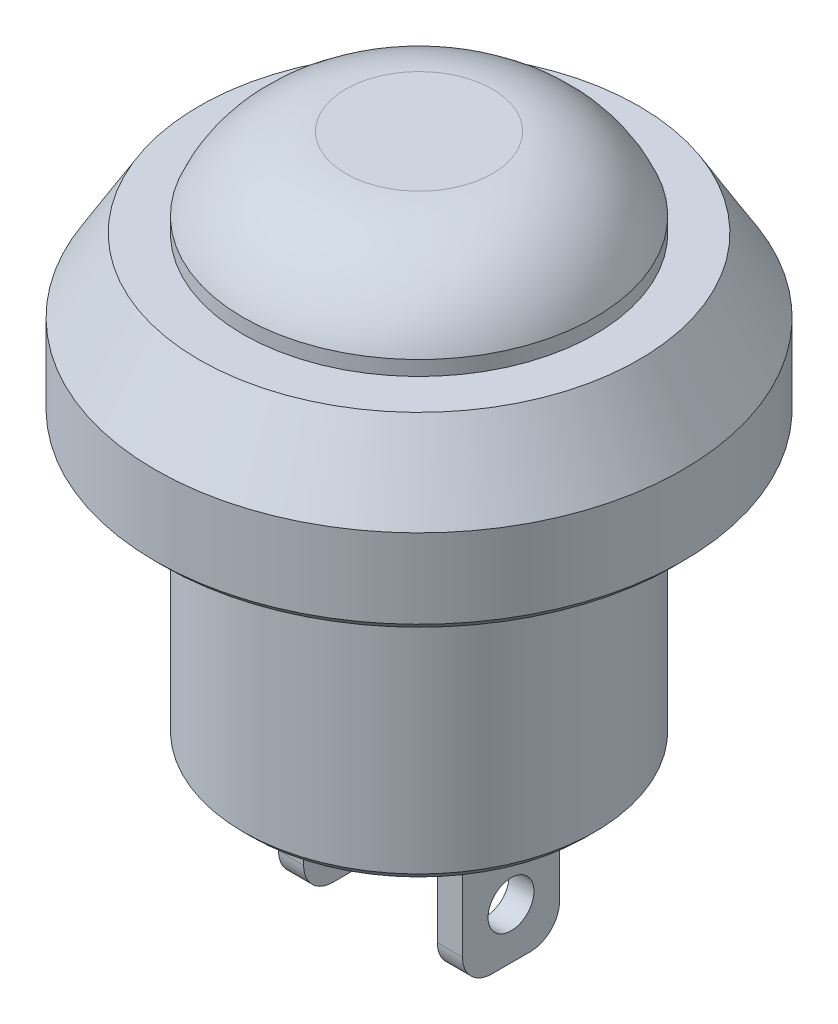
ISO-10303-21;
HEADER;
FILE_DESCRIPTION(('STEP AP214'),'2;1');
FILE_NAME('part.step','',(''),(''),'','','');
FILE_SCHEMA(('AUTOMOTIVE_DESIGN { 1 0 10303 214 1 1 1 1 }'));
ENDSEC;
DATA;
#1=APPLICATION_CONTEXT('core data for automotive mechanical design processes');
#2=APPLICATION_PROTOCOL_DEFINITION('international standard','automotive_design',2000,#1);
#3=PRODUCT_CONTEXT('',#1,'mechanical');
#4=PRODUCT('Part','Part','',(#3));
#5=PRODUCT_RELATED_PRODUCT_CATEGORY('part','',(#4));
#6=PRODUCT_DEFINITION_FORMATION('','',#4);
#7=PRODUCT_DEFINITION_CONTEXT('part definition',#1,'design');
#8=PRODUCT_DEFINITION('design','',#6,#7);
#9=PRODUCT_DEFINITION_SHAPE('','',#8);
#10=(LENGTH_UNIT() NAMED_UNIT(*) SI_UNIT(.MILLI.,.METRE.));
#11=(NAMED_UNIT(*) PLANE_ANGLE_UNIT() SI_UNIT($,.RADIAN.));
#12=(NAMED_UNIT(*) SI_UNIT($,.STERADIAN.) SOLID_ANGLE_UNIT());
#13=UNCERTAINTY_MEASURE_WITH_UNIT(LENGTH_MEASURE(1.E-05),#10,'distance_accuracy_value','');
#14=(GEOMETRIC_REPRESENTATION_CONTEXT(3) GLOBAL_UNCERTAINTY_ASSIGNED_CONTEXT((#13)) GLOBAL_UNIT_ASSIGNED_CONTEXT((#10,
#11,#12)) REPRESENTATION_CONTEXT('',''));
#15=CARTESIAN_POINT('',(0.,0.,0.));
#16=DIRECTION('',(0.,0.,1.));
#17=DIRECTION('',(1.,0.,0.));
#18=AXIS2_PLACEMENT_3D('',#15,#16,#17);
#19=CARTESIAN_POINT('',(6.00000000000001,-18.,0.));
#20=DIRECTION('',(0.,1.,0.));
#21=DIRECTION('',(0.,0.,1.));
#22=AXIS2_PLACEMENT_3D('',#19,#20,#21);
#23=PLANE('',#22);
#24=DIRECTION('',(0.,0.,1.));
#25=VECTOR('',#24,1.);
#26=CARTESIAN_POINT('',(3.1369153790141,-18.,-1.65757460368365));
#27=LINE('',#26,#25);
#28=CARTESIAN_POINT('',(3.1369153790141,-18.,-1.65757460368365));
#29=VERTEX_POINT('',#28);
#30=CARTESIAN_POINT('',(3.13691537901405,-18.,1.65757460368365));
#31=VERTEX_POINT('',#30);
#32=EDGE_CURVE('E159',#29,#31,#27,.T.);
#33=ORIENTED_EDGE('',*,*,#32,.F.);
#34=DIRECTION('',(1.,0.,0.));
#35=VECTOR('',#34,1.);
#36=CARTESIAN_POINT('',(2.28139300291935,-18.,-1.65757460368365));
#37=LINE('',#36,#35);
#38=CARTESIAN_POINT('',(2.28139300291935,-18.,-1.65757460368365));
#39=VERTEX_POINT('',#38);
#40=EDGE_CURVE('E164',#39,#29,#37,.T.);
#41=ORIENTED_EDGE('',*,*,#40,.F.);
#42=DIRECTION('',(0.,0.,-1.));
#43=VECTOR('',#42,1.);
#44=CARTESIAN_POINT('',(2.28139300291935,-18.,-1.65757460368365));
#45=LINE('',#44,#43);
#46=CARTESIAN_POINT('',(2.2813930029193,-18.,1.65757460368365));
#47=VERTEX_POINT('',#46);
#48=EDGE_CURVE('E173',#47,#39,#45,.T.);
#49=ORIENTED_EDGE('',*,*,#48,.F.);
#50=DIRECTION('',(-1.,0.,0.));
#51=VECTOR('',#50,1.);
#52=CARTESIAN_POINT('',(2.2813930029193,-18.,1.65757460368365));
#53=LINE('',#52,#51);
#54=EDGE_CURVE('E170',#31,#47,#53,.T.);
#55=ORIENTED_EDGE('',*,*,#54,.F.);
#56=EDGE_LOOP('',(#33,#41,#49,#55));
#57=FACE_BOUND('',#56,.T.);
#58=CARTESIAN_POINT('',(0.,-18.,0.));
#59=DIRECTION('',(0.,1.,0.));
#60=DIRECTION('',(0.,0.,1.));
#61=AXIS2_PLACEMENT_3D('',#58,#59,#60);
#62=CIRCLE('',#61,5.7);
#63=CARTESIAN_POINT('',(0.,-18.,5.7));
#64=VERTEX_POINT('',#63);
#65=EDGE_CURVE('E215',#64,#64,#62,.F.);
#66=ORIENTED_EDGE('',*,*,#65,.T.);
#67=EDGE_LOOP('',(#66));
#68=FACE_BOUND('',#67,.T.);
#69=DIRECTION('',(0.,0.,1.));
#70=VECTOR('',#69,1.);
#71=CARTESIAN_POINT('',(-2.28139300291935,-18.,-1.65757460368365));
#72=LINE('',#71,#70);
#73=CARTESIAN_POINT('',(-2.28139300291935,-18.,-1.65757460368365));
#74=VERTEX_POINT('',#73);
#75=CARTESIAN_POINT('',(-2.28139300291941,-18.,1.65757460368365));
#76=VERTEX_POINT('',#75);
#77=EDGE_CURVE('E126',#74,#76,#72,.T.);
#78=ORIENTED_EDGE('',*,*,#77,.F.);
#79=DIRECTION('',(1.,0.,0.));
#80=VECTOR('',#79,1.);
#81=CARTESIAN_POINT('',(-2.28139300291935,-18.,-1.65757460368365));
#82=LINE('',#81,#80);
#83=CARTESIAN_POINT('',(-3.1369153790141,-18.,-1.65757460368365));
#84=VERTEX_POINT('',#83);
#85=EDGE_CURVE('E138',#84,#74,#82,.T.);
#86=ORIENTED_EDGE('',*,*,#85,.F.);
#87=DIRECTION('',(0.,0.,-1.));
#88=VECTOR('',#87,1.);
#89=CARTESIAN_POINT('',(-3.1369153790141,-18.,-1.65757460368365));
#90=LINE('',#89,#88);
#91=CARTESIAN_POINT('',(-3.13691537901416,-18.,1.65757460368365));
#92=VERTEX_POINT('',#91);
#93=EDGE_CURVE('E147',#92,#84,#90,.T.);
#94=ORIENTED_EDGE('',*,*,#93,.F.);
#95=DIRECTION('',(-1.,0.,0.));
#96=VECTOR('',#95,1.);
#97=CARTESIAN_POINT('',(-2.28139300291941,-18.,1.65757460368365));
#98=LINE('',#97,#96);
#99=EDGE_CURVE('E141',#76,#92,#98,.T.);
#100=ORIENTED_EDGE('',*,*,#99,.F.);
#101=EDGE_LOOP('',(#78,#86,#94,#100));
#102=FACE_BOUND('',#101,.T.);
#103=ADVANCED_FACE('F32',(#57,#68,#102),#23,.F.);
#104=CARTESIAN_POINT('',(0.,0.,0.));
#105=DIRECTION('',(0.,1.,0.));
#106=DIRECTION('',(0.,0.,1.));
#107=AXIS2_PLACEMENT_3D('',#104,#105,#106);
#108=CYLINDRICAL_SURFACE('',#107,6.);
#109=CARTESIAN_POINT('',(0.,-8.8,0.));
#110=DIRECTION('',(0.,1.,0.));
#111=DIRECTION('',(0.,0.,1.));
#112=AXIS2_PLACEMENT_3D('',#109,#110,#111);
#113=CIRCLE('',#112,6.);
#114=CARTESIAN_POINT('',(0.,-8.8,6.));
#115=VERTEX_POINT('',#114);
#116=EDGE_CURVE('E209',#115,#115,#113,.F.);
#117=ORIENTED_EDGE('',*,*,#116,.T.);
#118=EDGE_LOOP('',(#117));
#119=FACE_BOUND('',#118,.T.);
#120=CARTESIAN_POINT('',(0.,-17.7,0.));
#121=DIRECTION('',(0.,1.,0.));
#122=DIRECTION('',(0.,0.,1.));
#123=AXIS2_PLACEMENT_3D('',#120,#121,#122);
#124=CIRCLE('',#123,6.);
#125=CARTESIAN_POINT('',(0.,-17.7,6.));
#126=VERTEX_POINT('',#125);
#127=EDGE_CURVE('E206',#126,#126,#124,.T.);
#128=ORIENTED_EDGE('',*,*,#127,.T.);
#129=EDGE_LOOP('',(#128));
#130=FACE_BOUND('',#129,.T.);
#131=ADVANCED_FACE('F276',(#119,#130),#108,.T.);
#132=CARTESIAN_POINT('',(8.99999999999999,-8.49999999999999,0.));
#133=DIRECTION('',(0.,1.,0.));
#134=DIRECTION('',(0.,0.,1.));
#135=AXIS2_PLACEMENT_3D('',#132,#133,#134);
#136=PLANE('',#135);
#137=CARTESIAN_POINT('',(0.,-8.49999999999999,0.));
#138=DIRECTION('',(0.,1.,0.));
#139=DIRECTION('',(0.,0.,1.));
#140=AXIS2_PLACEMENT_3D('',#137,#138,#139);
#141=CIRCLE('',#140,6.3);
#142=CARTESIAN_POINT('',(0.,-8.49999999999999,6.3));
#143=VERTEX_POINT('',#142);
#144=EDGE_CURVE('E203',#143,#143,#141,.T.);
#145=ORIENTED_EDGE('',*,*,#144,.T.);
#146=EDGE_LOOP('',(#145));
#147=FACE_BOUND('',#146,.T.);
#148=CARTESIAN_POINT('',(0.,-8.49999999999999,0.));
#149=DIRECTION('',(0.,1.,0.));
#150=DIRECTION('',(0.,0.,1.));
#151=AXIS2_PLACEMENT_3D('',#148,#149,#150);
#152=CIRCLE('',#151,8.7);
#153=CARTESIAN_POINT('',(0.,-8.49999999999999,8.7));
#154=VERTEX_POINT('',#153);
#155=EDGE_CURVE('E200',#154,#154,#152,.F.);
#156=ORIENTED_EDGE('',*,*,#155,.T.);
#157=EDGE_LOOP('',(#156));
#158=FACE_BOUND('',#157,.T.);
#159=ADVANCED_FACE('F281',(#147,#158),#136,.F.);
#160=CARTESIAN_POINT('',(0.,0.,0.));
#161=DIRECTION('',(0.,1.,0.));
#162=DIRECTION('',(0.,0.,1.));
#163=AXIS2_PLACEMENT_3D('',#160,#161,#162);
#164=CYLINDRICAL_SURFACE('',#163,9.);
#165=CARTESIAN_POINT('',(0.,-8.2,0.));
#166=DIRECTION('',(0.,1.,0.));
#167=DIRECTION('',(0.,0.,1.));
#168=AXIS2_PLACEMENT_3D('',#165,#166,#167);
#169=CIRCLE('',#168,9.);
#170=CARTESIAN_POINT('',(0.,-8.2,9.));
#171=VERTEX_POINT('',#170);
#172=EDGE_CURVE('E212',#171,#171,#169,.T.);
#173=ORIENTED_EDGE('',*,*,#172,.T.);
#174=EDGE_LOOP('',(#173));
#175=FACE_BOUND('',#174,.T.);
#176=CARTESIAN_POINT('',(0.,-5.50000000000001,0.));
#177=DIRECTION('',(0.,1.,0.));
#178=DIRECTION('',(0.,0.,1.));
#179=AXIS2_PLACEMENT_3D('',#176,#177,#178);
#180=CIRCLE('',#179,9.);
#181=CARTESIAN_POINT('',(0.,-5.50000000000001,9.));
#182=VERTEX_POINT('',#181);
#183=EDGE_CURVE('E197',#182,#182,#180,.T.);
#184=ORIENTED_EDGE('',*,*,#183,.F.);
#185=EDGE_LOOP('',(#184));
#186=FACE_BOUND('',#185,.T.);
#187=ADVANCED_FACE('F382',(#175,#186),#164,.T.);
#188=CARTESIAN_POINT('',(0.,-5.50000000000001,0.));
#189=DIRECTION('',(0.,-1.,0.));
#190=DIRECTION('',(0.,0.,-1.));
#191=AXIS2_PLACEMENT_3D('',#188,#189,#190);
#192=CONICAL_SURFACE('',#191,9.,0.540419500270584);
#193=CARTESIAN_POINT('',(0.,-3.,0.));
#194=DIRECTION('',(0.,1.,0.));
#195=DIRECTION('',(0.,0.,1.));
#196=AXIS2_PLACEMENT_3D('',#193,#194,#195);
#197=CIRCLE('',#196,7.5);
#198=CARTESIAN_POINT('',(0.,-3.,7.5));
#199=VERTEX_POINT('',#198);
#200=EDGE_CURVE('E194',#199,#199,#197,.T.);
#201=ORIENTED_EDGE('',*,*,#200,.F.);
#202=EDGE_LOOP('',(#201));
#203=FACE_BOUND('',#202,.T.);
#204=ORIENTED_EDGE('',*,*,#183,.T.);
#205=EDGE_LOOP('',(#204));
#206=FACE_BOUND('',#205,.T.);
#207=ADVANCED_FACE('F378',(#203,#206),#192,.T.);
#208=CARTESIAN_POINT('',(6.00000000000001,-3.,0.));
#209=DIRECTION('',(0.,-1.,0.));
#210=DIRECTION('',(0.,0.,-1.));
#211=AXIS2_PLACEMENT_3D('',#208,#209,#210);
#212=PLANE('',#211);
#213=CARTESIAN_POINT('',(0.,-3.,0.));
#214=DIRECTION('',(0.,1.,0.));
#215=DIRECTION('',(0.,0.,1.));
#216=AXIS2_PLACEMENT_3D('',#213,#214,#215);
#217=CIRCLE('',#216,6.);
#218=CARTESIAN_POINT('',(0.,-3.,6.));
#219=VERTEX_POINT('',#218);
#220=EDGE_CURVE('E191',#219,#219,#217,.T.);
#221=ORIENTED_EDGE('',*,*,#220,.F.);
#222=EDGE_LOOP('',(#221));
#223=FACE_BOUND('',#222,.T.);
#224=ORIENTED_EDGE('',*,*,#200,.T.);
#225=EDGE_LOOP('',(#224));
#226=FACE_BOUND('',#225,.T.);
#227=ADVANCED_FACE('F374',(#223,#226),#212,.F.);
#228=CARTESIAN_POINT('',(0.,0.,0.));
#229=DIRECTION('',(0.,1.,0.));
#230=DIRECTION('',(0.,0.,1.));
#231=AXIS2_PLACEMENT_3D('',#228,#229,#230);
#232=CYLINDRICAL_SURFACE('',#231,6.);
#233=CARTESIAN_POINT('',(0.,-2.5,0.));
#234=DIRECTION('',(0.,1.,0.));
#235=DIRECTION('',(0.,0.,1.));
#236=AXIS2_PLACEMENT_3D('',#233,#234,#235);
#237=CIRCLE('',#236,6.);
#238=CARTESIAN_POINT('',(0.,-2.5,6.));
#239=VERTEX_POINT('',#238);
#240=EDGE_CURVE('E188',#239,#239,#237,.T.);
#241=ORIENTED_EDGE('',*,*,#240,.F.);
#242=EDGE_LOOP('',(#241));
#243=FACE_BOUND('',#242,.T.);
#244=ORIENTED_EDGE('',*,*,#220,.T.);
#245=EDGE_LOOP('',(#244));
#246=FACE_BOUND('',#245,.T.);
#247=ADVANCED_FACE('F370',(#243,#246),#232,.T.);
#248=CARTESIAN_POINT('',(0.,-3.99446617661697,0.));
#249=DIRECTION('',(0.,1.,0.));
#250=DIRECTION('',(0.,0.,1.));
#251=AXIS2_PLACEMENT_3D('',#248,#249,#250);
#252=DEGENERATE_TOROIDAL_SURFACE('',#251,2.28966701670216,4.,.T.);
#253=CARTESIAN_POINT('',(0.,0.,0.));
#254=DIRECTION('',(0.,1.,0.));
#255=DIRECTION('',(0.,0.,1.));
#256=AXIS2_PLACEMENT_3D('',#253,#254,#255);
#257=CIRCLE('',#256,2.5);
#258=CARTESIAN_POINT('',(0.,0.,2.5));
#259=VERTEX_POINT('',#258);
#260=EDGE_CURVE('E185',#259,#259,#257,.T.);
#261=ORIENTED_EDGE('',*,*,#260,.F.);
#262=EDGE_LOOP('',(#261));
#263=FACE_BOUND('',#262,.T.);
#264=ORIENTED_EDGE('',*,*,#240,.T.);
#265=EDGE_LOOP('',(#264));
#266=FACE_BOUND('',#265,.T.);
#267=ADVANCED_FACE('F366',(#263,#266),#252,.T.);
#268=CARTESIAN_POINT('',(0.,0.,0.));
#269=DIRECTION('',(0.,-1.,0.));
#270=DIRECTION('',(0.,0.,-1.));
#271=AXIS2_PLACEMENT_3D('',#268,#269,#270);
#272=PLANE('',#271);
#273=ORIENTED_EDGE('',*,*,#260,.T.);
#274=EDGE_LOOP('',(#273));
#275=FACE_BOUND('',#274,.T.);
#276=ADVANCED_FACE('F290',(#275),#272,.F.);
#277=CARTESIAN_POINT('',(0.,-8.49999999999999,0.));
#278=DIRECTION('',(0.,1.,0.));
#279=DIRECTION('',(0.,0.,1.));
#280=AXIS2_PLACEMENT_3D('',#277,#278,#279);
#281=CONICAL_SURFACE('',#280,6.3,0.785398163397448);
#282=ORIENTED_EDGE('',*,*,#116,.F.);
#283=EDGE_LOOP('',(#282));
#284=FACE_BOUND('',#283,.T.);
#285=ORIENTED_EDGE('',*,*,#144,.F.);
#286=EDGE_LOOP('',(#285));
#287=FACE_BOUND('',#286,.T.);
#288=ADVANCED_FACE('F286',(#284,#287),#281,.T.);
#289=CARTESIAN_POINT('',(0.,-8.2,0.));
#290=DIRECTION('',(0.,1.,0.));
#291=DIRECTION('',(0.,0.,1.));
#292=AXIS2_PLACEMENT_3D('',#289,#290,#291);
#293=CONICAL_SURFACE('',#292,9.,0.785398163397454);
#294=ORIENTED_EDGE('',*,*,#155,.F.);
#295=EDGE_LOOP('',(#294));
#296=FACE_BOUND('',#295,.T.);
#297=ORIENTED_EDGE('',*,*,#172,.F.);
#298=EDGE_LOOP('',(#297));
#299=FACE_BOUND('',#298,.T.);
#300=ADVANCED_FACE('F289',(#296,#299),#293,.T.);
#301=CARTESIAN_POINT('',(0.,-17.7,0.));
#302=DIRECTION('',(0.,1.,0.));
#303=DIRECTION('',(0.,0.,1.));
#304=AXIS2_PLACEMENT_3D('',#301,#302,#303);
#305=CONICAL_SURFACE('',#304,6.,0.785398163397441);
#306=ORIENTED_EDGE('',*,*,#65,.F.);
#307=EDGE_LOOP('',(#306));
#308=FACE_BOUND('',#307,.T.);
#309=ORIENTED_EDGE('',*,*,#127,.F.);
#310=EDGE_LOOP('',(#309));
#311=FACE_BOUND('',#310,.T.);
#312=ADVANCED_FACE('F294',(#308,#311),#305,.T.);
#313=CARTESIAN_POINT('',(3.1369153790141,-23.,-1.65757460368365));
#314=DIRECTION('',(-1.,0.,0.));
#315=DIRECTION('',(0.,0.,1.));
#316=AXIS2_PLACEMENT_3D('',#313,#314,#315);
#317=PLANE('',#316);
#318=CARTESIAN_POINT('',(3.1369153790141,-21.2701843575543,0.));
#319=DIRECTION('',(-1.,0.,0.));
#320=DIRECTION('',(0.,0.,1.));
#321=AXIS2_PLACEMENT_3D('',#318,#319,#320);
#322=CIRCLE('',#321,0.783648519931506);
#323=CARTESIAN_POINT('',(3.1369153790141,-21.2701843575543,0.783648519931506));
#324=VERTEX_POINT('',#323);
#325=EDGE_CURVE('E142',#324,#324,#322,.T.);
#326=ORIENTED_EDGE('',*,*,#325,.T.);
#327=EDGE_LOOP('',(#326));
#328=FACE_BOUND('',#327,.T.);
#329=DIRECTION('',(0.,1.,0.));
#330=VECTOR('',#329,1.);
#331=CARTESIAN_POINT('',(3.13691537901405,-23.,1.65757460368365));
#332=LINE('',#331,#330);
#333=CARTESIAN_POINT('',(3.13691537901405,-22.,1.65757460368365));
#334=VERTEX_POINT('',#333);
#335=EDGE_CURVE('E183',#334,#31,#332,.T.);
#336=ORIENTED_EDGE('',*,*,#335,.F.);
#337=CARTESIAN_POINT('',(3.1369153790141,-22.,0.657574603683652));
#338=DIRECTION('',(-1.,0.,0.));
#339=DIRECTION('',(0.,0.,1.));
#340=AXIS2_PLACEMENT_3D('',#337,#338,#339);
#341=CIRCLE('',#340,1.);
#342=CARTESIAN_POINT('',(3.1369153790141,-23.,0.657574603683652));
#343=VERTEX_POINT('',#342);
#344=EDGE_CURVE('E40',#334,#343,#341,.F.);
#345=ORIENTED_EDGE('',*,*,#344,.T.);
#346=DIRECTION('',(0.,0.,1.));
#347=VECTOR('',#346,1.);
#348=CARTESIAN_POINT('',(3.1369153790141,-23.,-1.65757460368365));
#349=LINE('',#348,#347);
#350=CARTESIAN_POINT('',(3.1369153790141,-23.,-0.657574603683652));
#351=VERTEX_POINT('',#350);
#352=EDGE_CURVE('E160',#351,#343,#349,.T.);
#353=ORIENTED_EDGE('',*,*,#352,.F.);
#354=CARTESIAN_POINT('',(3.1369153790141,-22.,-0.657574603683653));
#355=DIRECTION('',(-1.,0.,0.));
#356=DIRECTION('',(0.,0.,1.));
#357=AXIS2_PLACEMENT_3D('',#354,#355,#356);
#358=CIRCLE('',#357,1.);
#359=CARTESIAN_POINT('',(3.1369153790141,-22.,-1.65757460368365));
#360=VERTEX_POINT('',#359);
#361=EDGE_CURVE('E47',#351,#360,#358,.F.);
#362=ORIENTED_EDGE('',*,*,#361,.T.);
#363=DIRECTION('',(0.,1.,0.));
#364=VECTOR('',#363,1.);
#365=CARTESIAN_POINT('',(3.1369153790141,-23.,-1.65757460368365));
#366=LINE('',#365,#364);
#367=EDGE_CURVE('E167',#360,#29,#366,.T.);
#368=ORIENTED_EDGE('',*,*,#367,.T.);
#369=ORIENTED_EDGE('',*,*,#32,.T.);
#370=EDGE_LOOP('',(#336,#345,#353,#362,#368,#369));
#371=FACE_BOUND('',#370,.T.);
#372=ADVANCED_FACE('F247',(#328,#371),#317,.F.);
#373=CARTESIAN_POINT('',(2.2813930029193,-23.,1.65757460368365));
#374=DIRECTION('',(0.,0.,-1.));
#375=DIRECTION('',(-1.,0.,0.));
#376=AXIS2_PLACEMENT_3D('',#373,#374,#375);
#377=PLANE('',#376);
#378=DIRECTION('',(0.,1.,0.));
#379=VECTOR('',#378,1.);
#380=CARTESIAN_POINT('',(2.2813930029193,-23.,1.65757460368365));
#381=LINE('',#380,#379);
#382=CARTESIAN_POINT('',(2.2813930029193,-22.,1.65757460368365));
#383=VERTEX_POINT('',#382);
#384=EDGE_CURVE('E181',#383,#47,#381,.T.);
#385=ORIENTED_EDGE('',*,*,#384,.F.);
#386=DIRECTION('',(-1.,0.,0.));
#387=VECTOR('',#386,1.);
#388=CARTESIAN_POINT('',(2.2813930029193,-22.,1.65757460368365));
#389=LINE('',#388,#387);
#390=EDGE_CURVE('E55',#383,#334,#389,.F.);
#391=ORIENTED_EDGE('',*,*,#390,.T.);
#392=ORIENTED_EDGE('',*,*,#335,.T.);
#393=ORIENTED_EDGE('',*,*,#54,.T.);
#394=EDGE_LOOP('',(#385,#391,#392,#393));
#395=FACE_BOUND('',#394,.T.);
#396=ADVANCED_FACE('F258',(#395),#377,.F.);
#397=CARTESIAN_POINT('',(2.28139300291935,-23.,-1.65757460368365));
#398=DIRECTION('',(1.,0.,0.));
#399=DIRECTION('',(0.,0.,-1.));
#400=AXIS2_PLACEMENT_3D('',#397,#398,#399);
#401=PLANE('',#400);
#402=CARTESIAN_POINT('',(2.28139300291935,-21.2701843575543,0.));
#403=DIRECTION('',(1.,0.,0.));
#404=DIRECTION('',(0.,0.,-1.));
#405=AXIS2_PLACEMENT_3D('',#402,#403,#404);
#406=CIRCLE('',#405,0.783648519931506);
#407=CARTESIAN_POINT('',(2.28139300291935,-21.2701843575543,-0.783648519931506));
#408=VERTEX_POINT('',#407);
#409=EDGE_CURVE('E326',#408,#408,#406,.T.);
#410=ORIENTED_EDGE('',*,*,#409,.T.);
#411=EDGE_LOOP('',(#410));
#412=FACE_BOUND('',#411,.T.);
#413=DIRECTION('',(0.,0.,-1.));
#414=VECTOR('',#413,1.);
#415=CARTESIAN_POINT('',(2.28139300291935,-23.,-1.65757460368365));
#416=LINE('',#415,#414);
#417=CARTESIAN_POINT('',(2.28139300291935,-23.,0.657574603683652));
#418=VERTEX_POINT('',#417);
#419=CARTESIAN_POINT('',(2.28139300291935,-23.,-0.657574603683653));
#420=VERTEX_POINT('',#419);
#421=EDGE_CURVE('E163',#418,#420,#416,.T.);
#422=ORIENTED_EDGE('',*,*,#421,.F.);
#423=CARTESIAN_POINT('',(2.28139300291935,-22.,0.657574603683652));
#424=DIRECTION('',(1.,0.,0.));
#425=DIRECTION('',(0.,0.,-1.));
#426=AXIS2_PLACEMENT_3D('',#423,#424,#425);
#427=CIRCLE('',#426,1.);
#428=EDGE_CURVE('E243',#418,#383,#427,.F.);
#429=ORIENTED_EDGE('',*,*,#428,.T.);
#430=ORIENTED_EDGE('',*,*,#384,.T.);
#431=ORIENTED_EDGE('',*,*,#48,.T.);
#432=DIRECTION('',(0.,1.,0.));
#433=VECTOR('',#432,1.);
#434=CARTESIAN_POINT('',(2.28139300291935,-23.,-1.65757460368365));
#435=LINE('',#434,#433);
#436=CARTESIAN_POINT('',(2.28139300291935,-22.,-1.65757460368365));
#437=VERTEX_POINT('',#436);
#438=EDGE_CURVE('E179',#437,#39,#435,.T.);
#439=ORIENTED_EDGE('',*,*,#438,.F.);
#440=CARTESIAN_POINT('',(2.28139300291935,-22.,-0.657574603683652));
#441=DIRECTION('',(1.,0.,0.));
#442=DIRECTION('',(0.,0.,-1.));
#443=AXIS2_PLACEMENT_3D('',#440,#441,#442);
#444=CIRCLE('',#443,1.);
#445=EDGE_CURVE('E241',#437,#420,#444,.F.);
#446=ORIENTED_EDGE('',*,*,#445,.T.);
#447=EDGE_LOOP('',(#422,#429,#430,#431,#439,#446));
#448=FACE_BOUND('',#447,.T.);
#449=ADVANCED_FACE('F256',(#412,#448),#401,.F.);
#450=CARTESIAN_POINT('',(2.28139300291935,-23.,-1.65757460368365));
#451=DIRECTION('',(0.,0.,1.));
#452=DIRECTION('',(1.,0.,0.));
#453=AXIS2_PLACEMENT_3D('',#450,#451,#452);
#454=PLANE('',#453);
#455=ORIENTED_EDGE('',*,*,#367,.F.);
#456=DIRECTION('',(1.,0.,0.));
#457=VECTOR('',#456,1.);
#458=CARTESIAN_POINT('',(2.28139300291935,-22.,-1.65757460368365));
#459=LINE('',#458,#457);
#460=EDGE_CURVE('E11',#360,#437,#459,.F.);
#461=ORIENTED_EDGE('',*,*,#460,.T.);
#462=ORIENTED_EDGE('',*,*,#438,.T.);
#463=ORIENTED_EDGE('',*,*,#40,.T.);
#464=EDGE_LOOP('',(#455,#461,#462,#463));
#465=FACE_BOUND('',#464,.T.);
#466=ADVANCED_FACE('F266',(#465),#454,.F.);
#467=CARTESIAN_POINT('',(0.,-23.,0.));
#468=DIRECTION('',(0.,1.,0.));
#469=DIRECTION('',(0.,0.,1.));
#470=AXIS2_PLACEMENT_3D('',#467,#468,#469);
#471=PLANE('',#470);
#472=ORIENTED_EDGE('',*,*,#352,.T.);
#473=DIRECTION('',(-1.,0.,0.));
#474=VECTOR('',#473,1.);
#475=CARTESIAN_POINT('',(0.,-23.,0.657574603683652));
#476=LINE('',#475,#474);
#477=EDGE_CURVE('E238',#343,#418,#476,.T.);
#478=ORIENTED_EDGE('',*,*,#477,.T.);
#479=ORIENTED_EDGE('',*,*,#421,.T.);
#480=DIRECTION('',(1.,0.,0.));
#481=VECTOR('',#480,1.);
#482=CARTESIAN_POINT('',(0.,-23.,-0.657574603683652));
#483=LINE('',#482,#481);
#484=EDGE_CURVE('E235',#420,#351,#483,.T.);
#485=ORIENTED_EDGE('',*,*,#484,.T.);
#486=EDGE_LOOP('',(#472,#478,#479,#485));
#487=FACE_BOUND('',#486,.T.);
#488=ADVANCED_FACE('F251',(#487),#471,.F.);
#489=CARTESIAN_POINT('',(-2.28139300291935,-23.,-1.65757460368365));
#490=DIRECTION('',(-1.,0.,0.));
#491=DIRECTION('',(0.,0.,1.));
#492=AXIS2_PLACEMENT_3D('',#489,#490,#491);
#493=PLANE('',#492);
#494=CARTESIAN_POINT('',(-2.28139300291935,-21.2701843575543,0.));
#495=DIRECTION('',(-1.,0.,0.));
#496=DIRECTION('',(0.,0.,1.));
#497=AXIS2_PLACEMENT_3D('',#494,#495,#496);
#498=CIRCLE('',#497,0.783648519931506);
#499=CARTESIAN_POINT('',(-2.28139300291935,-21.2701843575543,0.783648519931506));
#500=VERTEX_POINT('',#499);
#501=EDGE_CURVE('E329',#500,#500,#498,.T.);
#502=ORIENTED_EDGE('',*,*,#501,.T.);
#503=EDGE_LOOP('',(#502));
#504=FACE_BOUND('',#503,.T.);
#505=DIRECTION('',(0.,0.,1.));
#506=VECTOR('',#505,1.);
#507=CARTESIAN_POINT('',(-2.28139300291935,-23.,-1.65757460368365));
#508=LINE('',#507,#506);
#509=CARTESIAN_POINT('',(-2.28139300291935,-23.,-0.657574603683653));
#510=VERTEX_POINT('',#509);
#511=CARTESIAN_POINT('',(-2.28139300291935,-23.,0.657574603683652));
#512=VERTEX_POINT('',#511);
#513=EDGE_CURVE('E146',#510,#512,#508,.T.);
#514=ORIENTED_EDGE('',*,*,#513,.F.);
#515=CARTESIAN_POINT('',(-2.28139300291935,-22.,-0.657574603683652));
#516=DIRECTION('',(-1.,0.,0.));
#517=DIRECTION('',(0.,0.,1.));
#518=AXIS2_PLACEMENT_3D('',#515,#516,#517);
#519=CIRCLE('',#518,1.);
#520=CARTESIAN_POINT('',(-2.28139300291935,-22.,-1.65757460368365));
#521=VERTEX_POINT('',#520);
#522=EDGE_CURVE('E127',#510,#521,#519,.F.);
#523=ORIENTED_EDGE('',*,*,#522,.T.);
#524=DIRECTION('',(0.,1.,0.));
#525=VECTOR('',#524,1.);
#526=CARTESIAN_POINT('',(-2.28139300291935,-23.,-1.65757460368365));
#527=LINE('',#526,#525);
#528=EDGE_CURVE('E121',#521,#74,#527,.T.);
#529=ORIENTED_EDGE('',*,*,#528,.T.);
#530=ORIENTED_EDGE('',*,*,#77,.T.);
#531=DIRECTION('',(0.,1.,0.));
#532=VECTOR('',#531,1.);
#533=CARTESIAN_POINT('',(-2.28139300291941,-23.,1.65757460368365));
#534=LINE('',#533,#532);
#535=CARTESIAN_POINT('',(-2.28139300291941,-22.,1.65757460368365));
#536=VERTEX_POINT('',#535);
#537=EDGE_CURVE('E157',#536,#76,#534,.T.);
#538=ORIENTED_EDGE('',*,*,#537,.F.);
#539=CARTESIAN_POINT('',(-2.28139300291935,-22.,0.657574603683652));
#540=DIRECTION('',(-1.,0.,0.));
#541=DIRECTION('',(0.,0.,1.));
#542=AXIS2_PLACEMENT_3D('',#539,#540,#541);
#543=CIRCLE('',#542,1.);
#544=EDGE_CURVE('E224',#536,#512,#543,.F.);
#545=ORIENTED_EDGE('',*,*,#544,.T.);
#546=EDGE_LOOP('',(#514,#523,#529,#530,#538,#545));
#547=FACE_BOUND('',#546,.T.);
#548=ADVANCED_FACE('F124',(#504,#547),#493,.F.);
#549=CARTESIAN_POINT('',(-2.28139300291941,-23.,1.65757460368365));
#550=DIRECTION('',(0.,0.,-1.));
#551=DIRECTION('',(-1.,0.,0.));
#552=AXIS2_PLACEMENT_3D('',#549,#550,#551);
#553=PLANE('',#552);
#554=DIRECTION('',(0.,1.,0.));
#555=VECTOR('',#554,1.);
#556=CARTESIAN_POINT('',(-3.13691537901416,-23.,1.65757460368365));
#557=LINE('',#556,#555);
#558=CARTESIAN_POINT('',(-3.13691537901416,-22.,1.65757460368365));
#559=VERTEX_POINT('',#558);
#560=EDGE_CURVE('E155',#559,#92,#557,.T.);
#561=ORIENTED_EDGE('',*,*,#560,.F.);
#562=DIRECTION('',(-1.,0.,0.));
#563=VECTOR('',#562,1.);
#564=CARTESIAN_POINT('',(-2.28139300291941,-22.,1.65757460368365));
#565=LINE('',#564,#563);
#566=EDGE_CURVE('E233',#559,#536,#565,.F.);
#567=ORIENTED_EDGE('',*,*,#566,.T.);
#568=ORIENTED_EDGE('',*,*,#537,.T.);
#569=ORIENTED_EDGE('',*,*,#99,.T.);
#570=EDGE_LOOP('',(#561,#567,#568,#569));
#571=FACE_BOUND('',#570,.T.);
#572=ADVANCED_FACE('F321',(#571),#553,.F.);
#573=CARTESIAN_POINT('',(-3.1369153790141,-23.,-1.65757460368365));
#574=DIRECTION('',(1.,0.,0.));
#575=DIRECTION('',(0.,0.,-1.));
#576=AXIS2_PLACEMENT_3D('',#573,#574,#575);
#577=PLANE('',#576);
#578=CARTESIAN_POINT('',(-3.1369153790141,-21.2701843575543,0.));
#579=DIRECTION('',(-1.,0.,0.));
#580=DIRECTION('',(0.,0.,1.));
#581=AXIS2_PLACEMENT_3D('',#578,#579,#580);
#582=CIRCLE('',#581,0.783648519931506);
#583=CARTESIAN_POINT('',(-3.1369153790141,-21.2701843575543,0.783648519931506));
#584=VERTEX_POINT('',#583);
#585=EDGE_CURVE('E332',#584,#584,#582,.T.);
#586=ORIENTED_EDGE('',*,*,#585,.F.);
#587=EDGE_LOOP('',(#586));
#588=FACE_BOUND('',#587,.T.);
#589=DIRECTION('',(0.,1.,0.));
#590=VECTOR('',#589,1.);
#591=CARTESIAN_POINT('',(-3.1369153790141,-23.,-1.65757460368365));
#592=LINE('',#591,#590);
#593=CARTESIAN_POINT('',(-3.1369153790141,-22.,-1.65757460368365));
#594=VERTEX_POINT('',#593);
#595=EDGE_CURVE('E131',#594,#84,#592,.T.);
#596=ORIENTED_EDGE('',*,*,#595,.F.);
#597=CARTESIAN_POINT('',(-3.1369153790141,-22.,-0.657574603683653));
#598=DIRECTION('',(1.,0.,0.));
#599=DIRECTION('',(0.,0.,-1.));
#600=AXIS2_PLACEMENT_3D('',#597,#598,#599);
#601=CIRCLE('',#600,1.);
#602=CARTESIAN_POINT('',(-3.1369153790141,-23.,-0.657574603683652));
#603=VERTEX_POINT('',#602);
#604=EDGE_CURVE('E231',#594,#603,#601,.F.);
#605=ORIENTED_EDGE('',*,*,#604,.T.);
#606=DIRECTION('',(0.,0.,-1.));
#607=VECTOR('',#606,1.);
#608=CARTESIAN_POINT('',(-3.1369153790141,-23.,-1.65757460368365));
#609=LINE('',#608,#607);
#610=CARTESIAN_POINT('',(-3.1369153790141,-23.,0.657574603683652));
#611=VERTEX_POINT('',#610);
#612=EDGE_CURVE('E132',#611,#603,#609,.T.);
#613=ORIENTED_EDGE('',*,*,#612,.F.);
#614=CARTESIAN_POINT('',(-3.1369153790141,-22.,0.657574603683652));
#615=DIRECTION('',(1.,0.,0.));
#616=DIRECTION('',(0.,0.,-1.));
#617=AXIS2_PLACEMENT_3D('',#614,#615,#616);
#618=CIRCLE('',#617,1.);
#619=EDGE_CURVE('E229',#611,#559,#618,.F.);
#620=ORIENTED_EDGE('',*,*,#619,.T.);
#621=ORIENTED_EDGE('',*,*,#560,.T.);
#622=ORIENTED_EDGE('',*,*,#93,.T.);
#623=EDGE_LOOP('',(#596,#605,#613,#620,#621,#622));
#624=FACE_BOUND('',#623,.T.);
#625=ADVANCED_FACE('F318',(#588,#624),#577,.F.);
#626=CARTESIAN_POINT('',(-2.28139300291935,-23.,-1.65757460368365));
#627=DIRECTION('',(0.,0.,1.));
#628=DIRECTION('',(1.,0.,0.));
#629=AXIS2_PLACEMENT_3D('',#626,#627,#628);
#630=PLANE('',#629);
#631=ORIENTED_EDGE('',*,*,#528,.F.);
#632=DIRECTION('',(1.,0.,0.));
#633=VECTOR('',#632,1.);
#634=CARTESIAN_POINT('',(-3.1369153790141,-22.,-1.65757460368365));
#635=LINE('',#634,#633);
#636=EDGE_CURVE('E227',#521,#594,#635,.F.);
#637=ORIENTED_EDGE('',*,*,#636,.T.);
#638=ORIENTED_EDGE('',*,*,#595,.T.);
#639=ORIENTED_EDGE('',*,*,#85,.T.);
#640=EDGE_LOOP('',(#631,#637,#638,#639));
#641=FACE_BOUND('',#640,.T.);
#642=ADVANCED_FACE('F144',(#641),#630,.F.);
#643=CARTESIAN_POINT('',(0.,-23.,0.));
#644=DIRECTION('',(0.,-1.,0.));
#645=DIRECTION('',(0.,0.,-1.));
#646=AXIS2_PLACEMENT_3D('',#643,#644,#645);
#647=PLANE('',#646);
#648=ORIENTED_EDGE('',*,*,#612,.T.);
#649=DIRECTION('',(1.,0.,0.));
#650=VECTOR('',#649,1.);
#651=CARTESIAN_POINT('',(-2.28139300291935,-23.,-0.657574603683653));
#652=LINE('',#651,#650);
#653=EDGE_CURVE('E221',#603,#510,#652,.T.);
#654=ORIENTED_EDGE('',*,*,#653,.T.);
#655=ORIENTED_EDGE('',*,*,#513,.T.);
#656=DIRECTION('',(-1.,0.,0.));
#657=VECTOR('',#656,1.);
#658=CARTESIAN_POINT('',(-3.1369153790141,-23.,0.657574603683652));
#659=LINE('',#658,#657);
#660=EDGE_CURVE('E218',#512,#611,#659,.T.);
#661=ORIENTED_EDGE('',*,*,#660,.T.);
#662=EDGE_LOOP('',(#648,#654,#655,#661));
#663=FACE_BOUND('',#662,.T.);
#664=ADVANCED_FACE('F313',(#663),#647,.T.);
#665=CARTESIAN_POINT('',(8.86308462098589,-21.2701843575543,0.));
#666=DIRECTION('',(-1.,0.,0.));
#667=DIRECTION('',(0.,0.,1.));
#668=AXIS2_PLACEMENT_3D('',#665,#666,#667);
#669=CYLINDRICAL_SURFACE('',#668,0.783648519931506);
#670=ORIENTED_EDGE('',*,*,#585,.T.);
#671=EDGE_LOOP('',(#670));
#672=FACE_BOUND('',#671,.T.);
#673=ORIENTED_EDGE('',*,*,#501,.F.);
#674=EDGE_LOOP('',(#673));
#675=FACE_BOUND('',#674,.T.);
#676=ADVANCED_FACE('F336',(#672,#675),#669,.F.);
#677=ORIENTED_EDGE('',*,*,#409,.F.);
#678=EDGE_LOOP('',(#677));
#679=FACE_BOUND('',#678,.T.);
#680=ORIENTED_EDGE('',*,*,#325,.F.);
#681=EDGE_LOOP('',(#680));
#682=FACE_BOUND('',#681,.T.);
#683=ADVANCED_FACE('F302',(#679,#682),#669,.F.);
#684=CARTESIAN_POINT('',(0.,-22.,-0.657574603683653));
#685=DIRECTION('',(-1.,0.,0.));
#686=DIRECTION('',(0.,0.,1.));
#687=AXIS2_PLACEMENT_3D('',#684,#685,#686);
#688=CYLINDRICAL_SURFACE('',#687,1.);
#689=ORIENTED_EDGE('',*,*,#604,.F.);
#690=ORIENTED_EDGE('',*,*,#636,.F.);
#691=ORIENTED_EDGE('',*,*,#522,.F.);
#692=ORIENTED_EDGE('',*,*,#653,.F.);
#693=EDGE_LOOP('',(#689,#690,#691,#692));
#694=FACE_BOUND('',#693,.T.);
#695=ADVANCED_FACE('F299',(#694),#688,.T.);
#696=CARTESIAN_POINT('',(0.,-22.,0.657574603683651));
#697=DIRECTION('',(1.,0.,0.));
#698=DIRECTION('',(0.,0.,-1.));
#699=AXIS2_PLACEMENT_3D('',#696,#697,#698);
#700=CYLINDRICAL_SURFACE('',#699,1.);
#701=ORIENTED_EDGE('',*,*,#544,.F.);
#702=ORIENTED_EDGE('',*,*,#566,.F.);
#703=ORIENTED_EDGE('',*,*,#619,.F.);
#704=ORIENTED_EDGE('',*,*,#660,.F.);
#705=EDGE_LOOP('',(#701,#702,#703,#704));
#706=FACE_BOUND('',#705,.T.);
#707=ADVANCED_FACE('F274',(#706),#700,.T.);
#708=CARTESIAN_POINT('',(0.,-22.,0.657574603683651));
#709=DIRECTION('',(-1.,0.,0.));
#710=DIRECTION('',(0.,0.,1.));
#711=AXIS2_PLACEMENT_3D('',#708,#709,#710);
#712=CYLINDRICAL_SURFACE('',#711,1.);
#713=ORIENTED_EDGE('',*,*,#344,.F.);
#714=ORIENTED_EDGE('',*,*,#390,.F.);
#715=ORIENTED_EDGE('',*,*,#428,.F.);
#716=ORIENTED_EDGE('',*,*,#477,.F.);
#717=EDGE_LOOP('',(#713,#714,#715,#716));
#718=FACE_BOUND('',#717,.T.);
#719=ADVANCED_FACE('F254',(#718),#712,.T.);
#720=CARTESIAN_POINT('',(0.,-22.,-0.657574603683653));
#721=DIRECTION('',(1.,0.,0.));
#722=DIRECTION('',(0.,0.,-1.));
#723=AXIS2_PLACEMENT_3D('',#720,#721,#722);
#724=CYLINDRICAL_SURFACE('',#723,1.);
#725=ORIENTED_EDGE('',*,*,#445,.F.);
#726=ORIENTED_EDGE('',*,*,#460,.F.);
#727=ORIENTED_EDGE('',*,*,#361,.F.);
#728=ORIENTED_EDGE('',*,*,#484,.F.);
#729=EDGE_LOOP('',(#725,#726,#727,#728));
#730=FACE_BOUND('',#729,.T.);
#731=ADVANCED_FACE('F34',(#730),#724,.T.);
#732=CLOSED_SHELL('',(#103,#131,#159,#187,#207,#227,#247,#267,#276,#288,#300,#312,#372,#396,
#449,#466,#488,#548,#572,#625,#642,#664,#676,#683,#695,#707,#719,#731));
#733=MANIFOLD_SOLID_BREP('B2',#732);
#734=ADVANCED_BREP_SHAPE_REPRESENTATION('',(#18,#733),#14);
#735=SHAPE_DEFINITION_REPRESENTATION(#9,#734);
ENDSEC;
END-ISO-10303-21;
